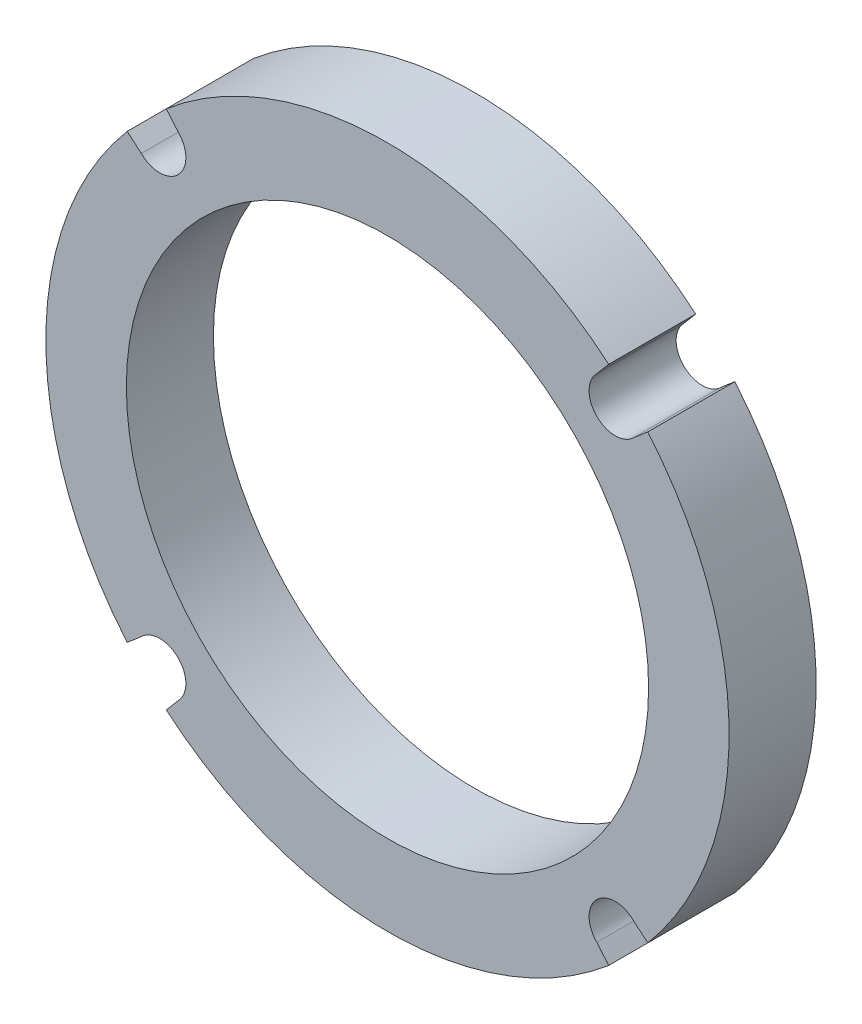
ISO-10303-21;
HEADER;
FILE_DESCRIPTION(('STEP AP214'),'2;1');
FILE_NAME('part.step','',(''),(''),'','','');
FILE_SCHEMA(('AUTOMOTIVE_DESIGN { 1 0 10303 214 1 1 1 1 }'));
ENDSEC;
DATA;
#1=APPLICATION_CONTEXT('core data for automotive mechanical design processes');
#2=APPLICATION_PROTOCOL_DEFINITION('international standard','automotive_design',2000,#1);
#3=PRODUCT_CONTEXT('',#1,'mechanical');
#4=PRODUCT('Part','Part','',(#3));
#5=PRODUCT_RELATED_PRODUCT_CATEGORY('part','',(#4));
#6=PRODUCT_DEFINITION_FORMATION('','',#4);
#7=PRODUCT_DEFINITION_CONTEXT('part definition',#1,'design');
#8=PRODUCT_DEFINITION('design','',#6,#7);
#9=PRODUCT_DEFINITION_SHAPE('','',#8);
#10=(LENGTH_UNIT() NAMED_UNIT(*) SI_UNIT(.MILLI.,.METRE.));
#11=(NAMED_UNIT(*) PLANE_ANGLE_UNIT() SI_UNIT($,.RADIAN.));
#12=(NAMED_UNIT(*) SI_UNIT($,.STERADIAN.) SOLID_ANGLE_UNIT());
#13=UNCERTAINTY_MEASURE_WITH_UNIT(LENGTH_MEASURE(1.E-05),#10,'distance_accuracy_value','');
#14=(GEOMETRIC_REPRESENTATION_CONTEXT(3) GLOBAL_UNCERTAINTY_ASSIGNED_CONTEXT((#13)) GLOBAL_UNIT_ASSIGNED_CONTEXT((#10,
#11,#12)) REPRESENTATION_CONTEXT('',''));
#15=CARTESIAN_POINT('',(0.,0.,0.));
#16=DIRECTION('',(0.,0.,1.));
#17=DIRECTION('',(1.,0.,0.));
#18=AXIS2_PLACEMENT_3D('',#15,#16,#17);
#19=CARTESIAN_POINT('',(-26.1629509039023,26.1629509039022,10.));
#20=DIRECTION('',(0.,0.,-1.));
#21=DIRECTION('',(-1.,0.,0.));
#22=AXIS2_PLACEMENT_3D('',#19,#20,#21);
#23=CYLINDRICAL_SURFACE('',#22,3.);
#24=CARTESIAN_POINT('',(-26.1629509039023,26.1629509039022,0.));
#25=DIRECTION('',(0.,0.,-1.));
#26=DIRECTION('',(1.,0.,0.));
#27=AXIS2_PLACEMENT_3D('',#24,#25,#26);
#28=CIRCLE('',#27,3.);
#29=CARTESIAN_POINT('',(-24.0416305603426,28.2842712474619,0.));
#30=VERTEX_POINT('',#29);
#31=CARTESIAN_POINT('',(-28.2842712474619,24.0416305603426,0.));
#32=VERTEX_POINT('',#31);
#33=EDGE_CURVE('E179',#30,#32,#28,.T.);
#34=ORIENTED_EDGE('',*,*,#33,.T.);
#35=DIRECTION('',(0.,0.,-1.));
#36=VECTOR('',#35,1.);
#37=CARTESIAN_POINT('',(-28.2842712474619,24.0416305603426,10.));
#38=LINE('',#37,#36);
#39=CARTESIAN_POINT('',(-28.2842712474619,24.0416305603426,10.));
#40=VERTEX_POINT('',#39);
#41=EDGE_CURVE('E11',#40,#32,#38,.T.);
#42=ORIENTED_EDGE('',*,*,#41,.F.);
#43=CARTESIAN_POINT('',(-26.1629509039023,26.1629509039022,10.));
#44=DIRECTION('',(0.,0.,-1.));
#45=DIRECTION('',(1.,0.,0.));
#46=AXIS2_PLACEMENT_3D('',#43,#44,#45);
#47=CIRCLE('',#46,3.);
#48=CARTESIAN_POINT('',(-24.0416305603426,28.2842712474619,10.));
#49=VERTEX_POINT('',#48);
#50=EDGE_CURVE('E210',#49,#40,#47,.T.);
#51=ORIENTED_EDGE('',*,*,#50,.F.);
#52=DIRECTION('',(0.,0.,-1.));
#53=VECTOR('',#52,1.);
#54=CARTESIAN_POINT('',(-24.0416305603426,28.2842712474619,10.));
#55=LINE('',#54,#53);
#56=EDGE_CURVE('E175',#49,#30,#55,.T.);
#57=ORIENTED_EDGE('',*,*,#56,.T.);
#58=EDGE_LOOP('',(#34,#42,#51,#57));
#59=FACE_BOUND('',#58,.T.);
#60=ADVANCED_FACE('F35',(#59),#23,.F.);
#61=CARTESIAN_POINT('',(-28.2842712474619,24.0416305603426,10.));
#62=DIRECTION('',(-0.64764842009554,-0.761939317759459,0.));
#63=DIRECTION('',(0.761939317759459,-0.64764842009554,0.));
#64=AXIS2_PLACEMENT_3D('',#61,#62,#63);
#65=PLANE('',#64);
#66=DIRECTION('',(-0.761939317759459,0.64764842009554,0.));
#67=VECTOR('',#66,1.);
#68=CARTESIAN_POINT('',(-28.2842712474619,24.0416305603426,0.));
#69=LINE('',#68,#67);
#70=CARTESIAN_POINT('',(-29.9061182220588,25.4202004887499,0.));
#71=VERTEX_POINT('',#70);
#72=EDGE_CURVE('E182',#32,#71,#69,.T.);
#73=ORIENTED_EDGE('',*,*,#72,.T.);
#74=DIRECTION('',(0.,0.,-1.));
#75=VECTOR('',#74,1.);
#76=CARTESIAN_POINT('',(-29.9061182220588,25.4202004887499,10.));
#77=LINE('',#76,#75);
#78=CARTESIAN_POINT('',(-29.9061182220588,25.4202004887499,10.));
#79=VERTEX_POINT('',#78);
#80=EDGE_CURVE('E43',#79,#71,#77,.T.);
#81=ORIENTED_EDGE('',*,*,#80,.F.);
#82=DIRECTION('',(-0.761939317759459,0.64764842009554,0.));
#83=VECTOR('',#82,1.);
#84=CARTESIAN_POINT('',(-28.2842712474619,24.0416305603426,10.));
#85=LINE('',#84,#83);
#86=EDGE_CURVE('E118',#40,#79,#85,.T.);
#87=ORIENTED_EDGE('',*,*,#86,.F.);
#88=ORIENTED_EDGE('',*,*,#41,.T.);
#89=EDGE_LOOP('',(#73,#81,#87,#88));
#90=FACE_BOUND('',#89,.T.);
#91=ADVANCED_FACE('F309',(#90),#65,.F.);
#92=CARTESIAN_POINT('',(0.,0.,10.));
#93=DIRECTION('',(0.,0.,-1.));
#94=DIRECTION('',(-1.,0.,0.));
#95=AXIS2_PLACEMENT_3D('',#92,#93,#94);
#96=CYLINDRICAL_SURFACE('',#95,39.25);
#97=CARTESIAN_POINT('',(0.,0.,0.));
#98=DIRECTION('',(0.,0.,1.));
#99=DIRECTION('',(1.,0.,0.));
#100=AXIS2_PLACEMENT_3D('',#97,#98,#99);
#101=CIRCLE('',#100,39.25);
#102=CARTESIAN_POINT('',(-29.906118222059,-25.4202004887496,0.));
#103=VERTEX_POINT('',#102);
#104=EDGE_CURVE('E185',#71,#103,#101,.T.);
#105=ORIENTED_EDGE('',*,*,#104,.T.);
#106=DIRECTION('',(0.,0.,-1.));
#107=VECTOR('',#106,1.);
#108=CARTESIAN_POINT('',(-29.906118222059,-25.4202004887496,10.));
#109=LINE('',#108,#107);
#110=CARTESIAN_POINT('',(-29.906118222059,-25.4202004887496,10.));
#111=VERTEX_POINT('',#110);
#112=EDGE_CURVE('E241',#111,#103,#109,.T.);
#113=ORIENTED_EDGE('',*,*,#112,.F.);
#114=CARTESIAN_POINT('',(0.,0.,10.));
#115=DIRECTION('',(0.,0.,1.));
#116=DIRECTION('',(1.,0.,0.));
#117=AXIS2_PLACEMENT_3D('',#114,#115,#116);
#118=CIRCLE('',#117,39.25);
#119=EDGE_CURVE('E249',#79,#111,#118,.T.);
#120=ORIENTED_EDGE('',*,*,#119,.F.);
#121=ORIENTED_EDGE('',*,*,#80,.T.);
#122=EDGE_LOOP('',(#105,#113,#120,#121));
#123=FACE_BOUND('',#122,.T.);
#124=ADVANCED_FACE('F247',(#123),#96,.T.);
#125=CARTESIAN_POINT('',(-28.2842712474621,-24.0416305603423,10.));
#126=DIRECTION('',(-0.647648420095533,0.761939317759466,0.));
#127=DIRECTION('',(-0.761939317759466,-0.647648420095533,0.));
#128=AXIS2_PLACEMENT_3D('',#125,#126,#127);
#129=PLANE('',#128);
#130=DIRECTION('',(0.761939317759466,0.647648420095533,0.));
#131=VECTOR('',#130,1.);
#132=CARTESIAN_POINT('',(-28.2842712474621,-24.0416305603423,0.));
#133=LINE('',#132,#131);
#134=CARTESIAN_POINT('',(-28.2842712474621,-24.0416305603423,0.));
#135=VERTEX_POINT('',#134);
#136=EDGE_CURVE('E187',#103,#135,#133,.T.);
#137=ORIENTED_EDGE('',*,*,#136,.T.);
#138=DIRECTION('',(0.,0.,-1.));
#139=VECTOR('',#138,1.);
#140=CARTESIAN_POINT('',(-28.2842712474621,-24.0416305603423,10.));
#141=LINE('',#140,#139);
#142=CARTESIAN_POINT('',(-28.2842712474621,-24.0416305603423,10.));
#143=VERTEX_POINT('',#142);
#144=EDGE_CURVE('E238',#143,#135,#141,.T.);
#145=ORIENTED_EDGE('',*,*,#144,.F.);
#146=DIRECTION('',(0.761939317759466,0.647648420095533,0.));
#147=VECTOR('',#146,1.);
#148=CARTESIAN_POINT('',(-28.2842712474621,-24.0416305603423,10.));
#149=LINE('',#148,#147);
#150=EDGE_CURVE('E267',#111,#143,#149,.T.);
#151=ORIENTED_EDGE('',*,*,#150,.F.);
#152=ORIENTED_EDGE('',*,*,#112,.T.);
#153=EDGE_LOOP('',(#137,#145,#151,#152));
#154=FACE_BOUND('',#153,.T.);
#155=ADVANCED_FACE('F258',(#154),#129,.F.);
#156=CARTESIAN_POINT('',(-26.1629509039023,-26.1629509039023,10.));
#157=DIRECTION('',(0.,0.,-1.));
#158=DIRECTION('',(-1.,0.,0.));
#159=AXIS2_PLACEMENT_3D('',#156,#157,#158);
#160=CYLINDRICAL_SURFACE('',#159,3.);
#161=CARTESIAN_POINT('',(-26.1629509039023,-26.1629509039023,0.));
#162=DIRECTION('',(0.,0.,-1.));
#163=DIRECTION('',(1.,0.,0.));
#164=AXIS2_PLACEMENT_3D('',#161,#162,#163);
#165=CIRCLE('',#164,3.);
#166=CARTESIAN_POINT('',(-24.0416305603426,-28.2842712474619,0.));
#167=VERTEX_POINT('',#166);
#168=EDGE_CURVE('E189',#135,#167,#165,.T.);
#169=ORIENTED_EDGE('',*,*,#168,.T.);
#170=DIRECTION('',(0.,0.,-1.));
#171=VECTOR('',#170,1.);
#172=CARTESIAN_POINT('',(-24.0416305603426,-28.2842712474619,10.));
#173=LINE('',#172,#171);
#174=CARTESIAN_POINT('',(-24.0416305603426,-28.2842712474619,10.));
#175=VERTEX_POINT('',#174);
#176=EDGE_CURVE('E235',#175,#167,#173,.T.);
#177=ORIENTED_EDGE('',*,*,#176,.F.);
#178=CARTESIAN_POINT('',(-26.1629509039023,-26.1629509039023,10.));
#179=DIRECTION('',(0.,0.,-1.));
#180=DIRECTION('',(1.,0.,0.));
#181=AXIS2_PLACEMENT_3D('',#178,#179,#180);
#182=CIRCLE('',#181,3.);
#183=EDGE_CURVE('E264',#143,#175,#182,.T.);
#184=ORIENTED_EDGE('',*,*,#183,.F.);
#185=ORIENTED_EDGE('',*,*,#144,.T.);
#186=EDGE_LOOP('',(#169,#177,#184,#185));
#187=FACE_BOUND('',#186,.T.);
#188=ADVANCED_FACE('F262',(#187),#160,.F.);
#189=CARTESIAN_POINT('',(-24.0416305603429,-28.2842712474616,10.));
#190=DIRECTION('',(0.761939317759454,-0.647648420095547,0.));
#191=DIRECTION('',(0.647648420095547,0.761939317759454,0.));
#192=AXIS2_PLACEMENT_3D('',#189,#190,#191);
#193=PLANE('',#192);
#194=DIRECTION('',(-0.647648420095547,-0.761939317759454,0.));
#195=VECTOR('',#194,1.);
#196=CARTESIAN_POINT('',(-24.0416305603429,-28.2842712474616,0.));
#197=LINE('',#196,#195);
#198=CARTESIAN_POINT('',(-25.4202004887503,-29.9061182220585,0.));
#199=VERTEX_POINT('',#198);
#200=EDGE_CURVE('E191',#167,#199,#197,.T.);
#201=ORIENTED_EDGE('',*,*,#200,.T.);
#202=DIRECTION('',(0.,0.,-1.));
#203=VECTOR('',#202,1.);
#204=CARTESIAN_POINT('',(-25.4202004887503,-29.9061182220585,10.));
#205=LINE('',#204,#203);
#206=CARTESIAN_POINT('',(-25.4202004887503,-29.9061182220585,10.));
#207=VERTEX_POINT('',#206);
#208=EDGE_CURVE('E232',#207,#199,#205,.T.);
#209=ORIENTED_EDGE('',*,*,#208,.F.);
#210=DIRECTION('',(-0.647648420095547,-0.761939317759454,0.));
#211=VECTOR('',#210,1.);
#212=CARTESIAN_POINT('',(-24.0416305603429,-28.2842712474616,10.));
#213=LINE('',#212,#211);
#214=EDGE_CURVE('E266',#175,#207,#213,.T.);
#215=ORIENTED_EDGE('',*,*,#214,.F.);
#216=ORIENTED_EDGE('',*,*,#176,.T.);
#217=EDGE_LOOP('',(#201,#209,#215,#216));
#218=FACE_BOUND('',#217,.T.);
#219=ADVANCED_FACE('F322',(#218),#193,.F.);
#220=CARTESIAN_POINT('',(0.,0.,10.));
#221=DIRECTION('',(0.,0.,-1.));
#222=DIRECTION('',(-1.,0.,0.));
#223=AXIS2_PLACEMENT_3D('',#220,#221,#222);
#224=CYLINDRICAL_SURFACE('',#223,39.25);
#225=CARTESIAN_POINT('',(0.,0.,0.));
#226=DIRECTION('',(0.,0.,1.));
#227=DIRECTION('',(1.,0.,0.));
#228=AXIS2_PLACEMENT_3D('',#225,#226,#227);
#229=CIRCLE('',#228,39.25);
#230=CARTESIAN_POINT('',(25.4202004887498,-29.906118222059,0.));
#231=VERTEX_POINT('',#230);
#232=EDGE_CURVE('E193',#199,#231,#229,.T.);
#233=ORIENTED_EDGE('',*,*,#232,.T.);
#234=DIRECTION('',(0.,0.,-1.));
#235=VECTOR('',#234,1.);
#236=CARTESIAN_POINT('',(25.4202004887498,-29.906118222059,10.));
#237=LINE('',#236,#235);
#238=CARTESIAN_POINT('',(25.4202004887498,-29.906118222059,10.));
#239=VERTEX_POINT('',#238);
#240=EDGE_CURVE('E229',#239,#231,#237,.T.);
#241=ORIENTED_EDGE('',*,*,#240,.F.);
#242=CARTESIAN_POINT('',(0.,0.,10.));
#243=DIRECTION('',(0.,0.,1.));
#244=DIRECTION('',(1.,0.,0.));
#245=AXIS2_PLACEMENT_3D('',#242,#243,#244);
#246=CIRCLE('',#245,39.25);
#247=EDGE_CURVE('E269',#207,#239,#246,.T.);
#248=ORIENTED_EDGE('',*,*,#247,.F.);
#249=ORIENTED_EDGE('',*,*,#208,.T.);
#250=EDGE_LOOP('',(#233,#241,#248,#249));
#251=FACE_BOUND('',#250,.T.);
#252=ADVANCED_FACE('F325',(#251),#224,.T.);
#253=CARTESIAN_POINT('',(24.0416305603424,-28.284271247462,10.));
#254=DIRECTION('',(-0.761939317759463,-0.647648420095536,0.));
#255=DIRECTION('',(0.647648420095536,-0.761939317759463,0.));
#256=AXIS2_PLACEMENT_3D('',#253,#254,#255);
#257=PLANE('',#256);
#258=DIRECTION('',(-0.647648420095536,0.761939317759463,0.));
#259=VECTOR('',#258,1.);
#260=CARTESIAN_POINT('',(24.0416305603424,-28.284271247462,0.));
#261=LINE('',#260,#259);
#262=CARTESIAN_POINT('',(24.0416305603424,-28.284271247462,0.));
#263=VERTEX_POINT('',#262);
#264=EDGE_CURVE('E195',#231,#263,#261,.T.);
#265=ORIENTED_EDGE('',*,*,#264,.T.);
#266=DIRECTION('',(0.,0.,-1.));
#267=VECTOR('',#266,1.);
#268=CARTESIAN_POINT('',(24.0416305603424,-28.284271247462,10.));
#269=LINE('',#268,#267);
#270=CARTESIAN_POINT('',(24.0416305603424,-28.284271247462,10.));
#271=VERTEX_POINT('',#270);
#272=EDGE_CURVE('E226',#271,#263,#269,.T.);
#273=ORIENTED_EDGE('',*,*,#272,.F.);
#274=DIRECTION('',(-0.647648420095536,0.761939317759463,0.));
#275=VECTOR('',#274,1.);
#276=CARTESIAN_POINT('',(24.0416305603424,-28.284271247462,10.));
#277=LINE('',#276,#275);
#278=EDGE_CURVE('E275',#239,#271,#277,.T.);
#279=ORIENTED_EDGE('',*,*,#278,.F.);
#280=ORIENTED_EDGE('',*,*,#240,.T.);
#281=EDGE_LOOP('',(#265,#273,#279,#280));
#282=FACE_BOUND('',#281,.T.);
#283=ADVANCED_FACE('F329',(#282),#257,.F.);
#284=CARTESIAN_POINT('',(26.1629509039023,-26.1629509039023,10.));
#285=DIRECTION('',(0.,0.,-1.));
#286=DIRECTION('',(-1.,0.,0.));
#287=AXIS2_PLACEMENT_3D('',#284,#285,#286);
#288=CYLINDRICAL_SURFACE('',#287,3.);
#289=CARTESIAN_POINT('',(26.1629509039023,-26.1629509039023,0.));
#290=DIRECTION('',(0.,0.,-1.));
#291=DIRECTION('',(1.,0.,0.));
#292=AXIS2_PLACEMENT_3D('',#289,#290,#291);
#293=CIRCLE('',#292,3.);
#294=CARTESIAN_POINT('',(28.2842712474619,-24.0416305603426,0.));
#295=VERTEX_POINT('',#294);
#296=EDGE_CURVE('E197',#263,#295,#293,.T.);
#297=ORIENTED_EDGE('',*,*,#296,.T.);
#298=DIRECTION('',(0.,0.,-1.));
#299=VECTOR('',#298,1.);
#300=CARTESIAN_POINT('',(28.2842712474619,-24.0416305603426,10.));
#301=LINE('',#300,#299);
#302=CARTESIAN_POINT('',(28.2842712474619,-24.0416305603426,10.));
#303=VERTEX_POINT('',#302);
#304=EDGE_CURVE('E223',#303,#295,#301,.T.);
#305=ORIENTED_EDGE('',*,*,#304,.F.);
#306=CARTESIAN_POINT('',(26.1629509039023,-26.1629509039023,10.));
#307=DIRECTION('',(0.,0.,-1.));
#308=DIRECTION('',(1.,0.,0.));
#309=AXIS2_PLACEMENT_3D('',#306,#307,#308);
#310=CIRCLE('',#309,3.);
#311=EDGE_CURVE('E277',#271,#303,#310,.T.);
#312=ORIENTED_EDGE('',*,*,#311,.F.);
#313=ORIENTED_EDGE('',*,*,#272,.T.);
#314=EDGE_LOOP('',(#297,#305,#312,#313));
#315=FACE_BOUND('',#314,.T.);
#316=ADVANCED_FACE('F333',(#315),#288,.F.);
#317=CARTESIAN_POINT('',(28.2842712474617,-24.0416305603428,10.));
#318=DIRECTION('',(0.647648420095544,0.761939317759456,0.));
#319=DIRECTION('',(-0.761939317759457,0.647648420095544,0.));
#320=AXIS2_PLACEMENT_3D('',#317,#318,#319);
#321=PLANE('',#320);
#322=DIRECTION('',(0.761939317759456,-0.647648420095544,0.));
#323=VECTOR('',#322,1.);
#324=CARTESIAN_POINT('',(28.2842712474617,-24.0416305603428,0.));
#325=LINE('',#324,#323);
#326=CARTESIAN_POINT('',(29.9061182220586,-25.4202004887502,0.));
#327=VERTEX_POINT('',#326);
#328=EDGE_CURVE('E199',#295,#327,#325,.T.);
#329=ORIENTED_EDGE('',*,*,#328,.T.);
#330=DIRECTION('',(0.,0.,-1.));
#331=VECTOR('',#330,1.);
#332=CARTESIAN_POINT('',(29.9061182220586,-25.4202004887502,10.));
#333=LINE('',#332,#331);
#334=CARTESIAN_POINT('',(29.9061182220586,-25.4202004887502,10.));
#335=VERTEX_POINT('',#334);
#336=EDGE_CURVE('E220',#335,#327,#333,.T.);
#337=ORIENTED_EDGE('',*,*,#336,.F.);
#338=DIRECTION('',(0.761939317759456,-0.647648420095544,0.));
#339=VECTOR('',#338,1.);
#340=CARTESIAN_POINT('',(28.2842712474617,-24.0416305603428,10.));
#341=LINE('',#340,#339);
#342=EDGE_CURVE('E279',#303,#335,#341,.T.);
#343=ORIENTED_EDGE('',*,*,#342,.F.);
#344=ORIENTED_EDGE('',*,*,#304,.T.);
#345=EDGE_LOOP('',(#329,#337,#343,#344));
#346=FACE_BOUND('',#345,.T.);
#347=ADVANCED_FACE('F337',(#346),#321,.F.);
#348=CARTESIAN_POINT('',(0.,0.,10.));
#349=DIRECTION('',(0.,0.,-1.));
#350=DIRECTION('',(-1.,0.,0.));
#351=AXIS2_PLACEMENT_3D('',#348,#349,#350);
#352=CYLINDRICAL_SURFACE('',#351,39.25);
#353=CARTESIAN_POINT('',(0.,0.,0.));
#354=DIRECTION('',(0.,0.,1.));
#355=DIRECTION('',(1.,0.,0.));
#356=AXIS2_PLACEMENT_3D('',#353,#354,#355);
#357=CIRCLE('',#356,39.25);
#358=CARTESIAN_POINT('',(29.9061182220589,25.4202004887499,0.));
#359=VERTEX_POINT('',#358);
#360=EDGE_CURVE('E201',#327,#359,#357,.T.);
#361=ORIENTED_EDGE('',*,*,#360,.T.);
#362=DIRECTION('',(0.,0.,-1.));
#363=VECTOR('',#362,1.);
#364=CARTESIAN_POINT('',(29.9061182220589,25.4202004887499,10.));
#365=LINE('',#364,#363);
#366=CARTESIAN_POINT('',(29.9061182220589,25.4202004887499,10.));
#367=VERTEX_POINT('',#366);
#368=EDGE_CURVE('E217',#367,#359,#365,.T.);
#369=ORIENTED_EDGE('',*,*,#368,.F.);
#370=CARTESIAN_POINT('',(0.,0.,10.));
#371=DIRECTION('',(0.,0.,1.));
#372=DIRECTION('',(1.,0.,0.));
#373=AXIS2_PLACEMENT_3D('',#370,#371,#372);
#374=CIRCLE('',#373,39.25);
#375=EDGE_CURVE('E281',#335,#367,#374,.T.);
#376=ORIENTED_EDGE('',*,*,#375,.F.);
#377=ORIENTED_EDGE('',*,*,#336,.T.);
#378=EDGE_LOOP('',(#361,#369,#376,#377));
#379=FACE_BOUND('',#378,.T.);
#380=ADVANCED_FACE('F341',(#379),#352,.T.);
#381=CARTESIAN_POINT('',(28.284271247462,24.0416305603425,10.));
#382=DIRECTION('',(0.647648420095538,-0.761939317759462,0.));
#383=DIRECTION('',(0.761939317759462,0.647648420095538,0.));
#384=AXIS2_PLACEMENT_3D('',#381,#382,#383);
#385=PLANE('',#384);
#386=DIRECTION('',(-0.761939317759462,-0.647648420095538,0.));
#387=VECTOR('',#386,1.);
#388=CARTESIAN_POINT('',(28.284271247462,24.0416305603425,0.));
#389=LINE('',#388,#387);
#390=CARTESIAN_POINT('',(28.284271247462,24.0416305603425,0.));
#391=VERTEX_POINT('',#390);
#392=EDGE_CURVE('E203',#359,#391,#389,.T.);
#393=ORIENTED_EDGE('',*,*,#392,.T.);
#394=DIRECTION('',(0.,0.,-1.));
#395=VECTOR('',#394,1.);
#396=CARTESIAN_POINT('',(28.284271247462,24.0416305603425,10.));
#397=LINE('',#396,#395);
#398=CARTESIAN_POINT('',(28.284271247462,24.0416305603425,10.));
#399=VERTEX_POINT('',#398);
#400=EDGE_CURVE('E214',#399,#391,#397,.T.);
#401=ORIENTED_EDGE('',*,*,#400,.F.);
#402=DIRECTION('',(-0.761939317759462,-0.647648420095538,0.));
#403=VECTOR('',#402,1.);
#404=CARTESIAN_POINT('',(28.284271247462,24.0416305603425,10.));
#405=LINE('',#404,#403);
#406=EDGE_CURVE('E283',#367,#399,#405,.T.);
#407=ORIENTED_EDGE('',*,*,#406,.F.);
#408=ORIENTED_EDGE('',*,*,#368,.T.);
#409=EDGE_LOOP('',(#393,#401,#407,#408));
#410=FACE_BOUND('',#409,.T.);
#411=ADVANCED_FACE('F289',(#410),#385,.F.);
#412=CARTESIAN_POINT('',(26.1629509039023,26.1629509039023,10.));
#413=DIRECTION('',(0.,0.,-1.));
#414=DIRECTION('',(-1.,0.,0.));
#415=AXIS2_PLACEMENT_3D('',#412,#413,#414);
#416=CYLINDRICAL_SURFACE('',#415,3.);
#417=CARTESIAN_POINT('',(26.1629509039023,26.1629509039023,0.));
#418=DIRECTION('',(0.,0.,-1.));
#419=DIRECTION('',(1.,0.,0.));
#420=AXIS2_PLACEMENT_3D('',#417,#418,#419);
#421=CIRCLE('',#420,3.);
#422=CARTESIAN_POINT('',(24.0416305603426,28.2842712474619,0.));
#423=VERTEX_POINT('',#422);
#424=EDGE_CURVE('E205',#391,#423,#421,.T.);
#425=ORIENTED_EDGE('',*,*,#424,.T.);
#426=DIRECTION('',(0.,0.,-1.));
#427=VECTOR('',#426,1.);
#428=CARTESIAN_POINT('',(24.0416305603426,28.2842712474619,10.));
#429=LINE('',#428,#427);
#430=CARTESIAN_POINT('',(24.0416305603426,28.2842712474619,10.));
#431=VERTEX_POINT('',#430);
#432=EDGE_CURVE('E170',#431,#423,#429,.T.);
#433=ORIENTED_EDGE('',*,*,#432,.F.);
#434=CARTESIAN_POINT('',(26.1629509039023,26.1629509039023,10.));
#435=DIRECTION('',(0.,0.,-1.));
#436=DIRECTION('',(1.,0.,0.));
#437=AXIS2_PLACEMENT_3D('',#434,#435,#436);
#438=CIRCLE('',#437,3.);
#439=EDGE_CURVE('E161',#399,#431,#438,.T.);
#440=ORIENTED_EDGE('',*,*,#439,.F.);
#441=ORIENTED_EDGE('',*,*,#400,.T.);
#442=EDGE_LOOP('',(#425,#433,#440,#441));
#443=FACE_BOUND('',#442,.T.);
#444=ADVANCED_FACE('F293',(#443),#416,.F.);
#445=CARTESIAN_POINT('',(24.0416305603427,28.2842712474618,10.));
#446=DIRECTION('',(-0.761939317759458,0.647648420095542,0.));
#447=DIRECTION('',(-0.647648420095542,-0.761939317759458,0.));
#448=AXIS2_PLACEMENT_3D('',#445,#446,#447);
#449=PLANE('',#448);
#450=DIRECTION('',(0.647648420095542,0.761939317759458,0.));
#451=VECTOR('',#450,1.);
#452=CARTESIAN_POINT('',(24.0416305603427,28.2842712474618,0.));
#453=LINE('',#452,#451);
#454=CARTESIAN_POINT('',(25.42020048875,29.9061182220587,0.));
#455=VERTEX_POINT('',#454);
#456=EDGE_CURVE('E169',#423,#455,#453,.T.);
#457=ORIENTED_EDGE('',*,*,#456,.T.);
#458=DIRECTION('',(0.,0.,-1.));
#459=VECTOR('',#458,1.);
#460=CARTESIAN_POINT('',(25.42020048875,29.9061182220587,10.));
#461=LINE('',#460,#459);
#462=CARTESIAN_POINT('',(25.42020048875,29.9061182220587,10.));
#463=VERTEX_POINT('',#462);
#464=EDGE_CURVE('E166',#463,#455,#461,.T.);
#465=ORIENTED_EDGE('',*,*,#464,.F.);
#466=DIRECTION('',(0.647648420095542,0.761939317759458,0.));
#467=VECTOR('',#466,1.);
#468=CARTESIAN_POINT('',(24.0416305603427,28.2842712474618,10.));
#469=LINE('',#468,#467);
#470=EDGE_CURVE('E155',#431,#463,#469,.T.);
#471=ORIENTED_EDGE('',*,*,#470,.F.);
#472=ORIENTED_EDGE('',*,*,#432,.T.);
#473=EDGE_LOOP('',(#457,#465,#471,#472));
#474=FACE_BOUND('',#473,.T.);
#475=ADVANCED_FACE('F167',(#474),#449,.F.);
#476=CARTESIAN_POINT('',(0.,0.,10.));
#477=DIRECTION('',(0.,0.,-1.));
#478=DIRECTION('',(-1.,0.,0.));
#479=AXIS2_PLACEMENT_3D('',#476,#477,#478);
#480=CYLINDRICAL_SURFACE('',#479,39.25);
#481=CARTESIAN_POINT('',(0.,0.,0.));
#482=DIRECTION('',(0.,0.,1.));
#483=DIRECTION('',(1.,0.,0.));
#484=AXIS2_PLACEMENT_3D('',#481,#482,#483);
#485=CIRCLE('',#484,39.25);
#486=CARTESIAN_POINT('',(-25.42020048875,29.9061182220588,0.));
#487=VERTEX_POINT('',#486);
#488=EDGE_CURVE('E104',#455,#487,#485,.T.);
#489=ORIENTED_EDGE('',*,*,#488,.T.);
#490=DIRECTION('',(0.,0.,-1.));
#491=VECTOR('',#490,1.);
#492=CARTESIAN_POINT('',(-25.42020048875,29.9061182220588,10.));
#493=LINE('',#492,#491);
#494=CARTESIAN_POINT('',(-25.42020048875,29.9061182220588,10.));
#495=VERTEX_POINT('',#494);
#496=EDGE_CURVE('E171',#495,#487,#493,.T.);
#497=ORIENTED_EDGE('',*,*,#496,.F.);
#498=CARTESIAN_POINT('',(0.,0.,10.));
#499=DIRECTION('',(0.,0.,1.));
#500=DIRECTION('',(1.,0.,0.));
#501=AXIS2_PLACEMENT_3D('',#498,#499,#500);
#502=CIRCLE('',#501,39.25);
#503=EDGE_CURVE('E159',#463,#495,#502,.T.);
#504=ORIENTED_EDGE('',*,*,#503,.F.);
#505=ORIENTED_EDGE('',*,*,#464,.T.);
#506=EDGE_LOOP('',(#489,#497,#504,#505));
#507=FACE_BOUND('',#506,.T.);
#508=ADVANCED_FACE('F173',(#507),#480,.T.);
#509=CARTESIAN_POINT('',(-24.0416305603426,28.2842712474619,10.));
#510=DIRECTION('',(0.761939317759458,0.647648420095542,0.));
#511=DIRECTION('',(-0.647648420095542,0.761939317759458,0.));
#512=AXIS2_PLACEMENT_3D('',#509,#510,#511);
#513=PLANE('',#512);
#514=DIRECTION('',(0.647648420095542,-0.761939317759458,0.));
#515=VECTOR('',#514,1.);
#516=CARTESIAN_POINT('',(-24.0416305603426,28.2842712474619,0.));
#517=LINE('',#516,#515);
#518=EDGE_CURVE('E110',#487,#30,#517,.T.);
#519=ORIENTED_EDGE('',*,*,#518,.T.);
#520=ORIENTED_EDGE('',*,*,#56,.F.);
#521=DIRECTION('',(0.647648420095542,-0.761939317759458,0.));
#522=VECTOR('',#521,1.);
#523=CARTESIAN_POINT('',(-24.0416305603426,28.2842712474619,10.));
#524=LINE('',#523,#522);
#525=EDGE_CURVE('E51',#495,#49,#524,.T.);
#526=ORIENTED_EDGE('',*,*,#525,.F.);
#527=ORIENTED_EDGE('',*,*,#496,.T.);
#528=EDGE_LOOP('',(#519,#520,#526,#527));
#529=FACE_BOUND('',#528,.T.);
#530=ADVANCED_FACE('F297',(#529),#513,.F.);
#531=CARTESIAN_POINT('',(-26.1629509039023,26.1629509039022,10.));
#532=DIRECTION('',(0.,0.,1.));
#533=DIRECTION('',(1.,0.,0.));
#534=AXIS2_PLACEMENT_3D('',#531,#532,#533);
#535=PLANE('',#534);
#536=CARTESIAN_POINT('',(0.,0.,10.));
#537=DIRECTION('',(0.,0.,-1.));
#538=DIRECTION('',(-1.,0.,0.));
#539=AXIS2_PLACEMENT_3D('',#536,#537,#538);
#540=CIRCLE('',#539,30.);
#541=CARTESIAN_POINT('',(-30.,0.,10.));
#542=VERTEX_POINT('',#541);
#543=EDGE_CURVE('E183',#542,#542,#540,.T.);
#544=ORIENTED_EDGE('',*,*,#543,.T.);
#545=EDGE_LOOP('',(#544));
#546=FACE_BOUND('',#545,.T.);
#547=ORIENTED_EDGE('',*,*,#50,.T.);
#548=ORIENTED_EDGE('',*,*,#86,.T.);
#549=ORIENTED_EDGE('',*,*,#119,.T.);
#550=ORIENTED_EDGE('',*,*,#150,.T.);
#551=ORIENTED_EDGE('',*,*,#183,.T.);
#552=ORIENTED_EDGE('',*,*,#214,.T.);
#553=ORIENTED_EDGE('',*,*,#247,.T.);
#554=ORIENTED_EDGE('',*,*,#278,.T.);
#555=ORIENTED_EDGE('',*,*,#311,.T.);
#556=ORIENTED_EDGE('',*,*,#342,.T.);
#557=ORIENTED_EDGE('',*,*,#375,.T.);
#558=ORIENTED_EDGE('',*,*,#406,.T.);
#559=ORIENTED_EDGE('',*,*,#439,.T.);
#560=ORIENTED_EDGE('',*,*,#470,.T.);
#561=ORIENTED_EDGE('',*,*,#503,.T.);
#562=ORIENTED_EDGE('',*,*,#525,.T.);
#563=EDGE_LOOP('',(#547,#548,#549,#550,#551,#552,#553,#554,#555,#556,#557,#558,#559,#560,#561,#562));
#564=FACE_BOUND('',#563,.T.);
#565=ADVANCED_FACE('F157',(#546,#564),#535,.T.);
#566=CARTESIAN_POINT('',(-26.1629509039023,26.1629509039022,0.));
#567=DIRECTION('',(0.,0.,1.));
#568=DIRECTION('',(1.,0.,0.));
#569=AXIS2_PLACEMENT_3D('',#566,#567,#568);
#570=PLANE('',#569);
#571=CARTESIAN_POINT('',(0.,0.,0.));
#572=DIRECTION('',(0.,0.,-1.));
#573=DIRECTION('',(-1.,0.,0.));
#574=AXIS2_PLACEMENT_3D('',#571,#572,#573);
#575=CIRCLE('',#574,30.);
#576=CARTESIAN_POINT('',(-30.,0.,0.));
#577=VERTEX_POINT('',#576);
#578=EDGE_CURVE('E396',#577,#577,#575,.T.);
#579=ORIENTED_EDGE('',*,*,#578,.F.);
#580=EDGE_LOOP('',(#579));
#581=FACE_BOUND('',#580,.T.);
#582=ORIENTED_EDGE('',*,*,#33,.F.);
#583=ORIENTED_EDGE('',*,*,#518,.F.);
#584=ORIENTED_EDGE('',*,*,#488,.F.);
#585=ORIENTED_EDGE('',*,*,#456,.F.);
#586=ORIENTED_EDGE('',*,*,#424,.F.);
#587=ORIENTED_EDGE('',*,*,#392,.F.);
#588=ORIENTED_EDGE('',*,*,#360,.F.);
#589=ORIENTED_EDGE('',*,*,#328,.F.);
#590=ORIENTED_EDGE('',*,*,#296,.F.);
#591=ORIENTED_EDGE('',*,*,#264,.F.);
#592=ORIENTED_EDGE('',*,*,#232,.F.);
#593=ORIENTED_EDGE('',*,*,#200,.F.);
#594=ORIENTED_EDGE('',*,*,#168,.F.);
#595=ORIENTED_EDGE('',*,*,#136,.F.);
#596=ORIENTED_EDGE('',*,*,#104,.F.);
#597=ORIENTED_EDGE('',*,*,#72,.F.);
#598=EDGE_LOOP('',(#582,#583,#584,#585,#586,#587,#588,#589,#590,#591,#592,#593,#594,#595,#596,#597));
#599=FACE_BOUND('',#598,.T.);
#600=ADVANCED_FACE('F253',(#581,#599),#570,.F.);
#601=CARTESIAN_POINT('',(0.,0.,10.));
#602=DIRECTION('',(0.,0.,-1.));
#603=DIRECTION('',(-1.,0.,0.));
#604=AXIS2_PLACEMENT_3D('',#601,#602,#603);
#605=CYLINDRICAL_SURFACE('',#604,30.);
#606=ORIENTED_EDGE('',*,*,#543,.F.);
#607=EDGE_LOOP('',(#606));
#608=FACE_BOUND('',#607,.T.);
#609=ORIENTED_EDGE('',*,*,#578,.T.);
#610=EDGE_LOOP('',(#609));
#611=FACE_BOUND('',#610,.T.);
#612=ADVANCED_FACE('F378',(#608,#611),#605,.F.);
#613=CLOSED_SHELL('',(#60,#91,#124,#155,#188,#219,#252,#283,#316,#347,#380,#411,#444,#475,#508,
#530,#565,#600,#612));
#614=MANIFOLD_SOLID_BREP('B2',#613);
#615=ADVANCED_BREP_SHAPE_REPRESENTATION('',(#18,#614),#14);
#616=SHAPE_DEFINITION_REPRESENTATION(#9,#615);
ENDSEC;
END-ISO-10303-21;
